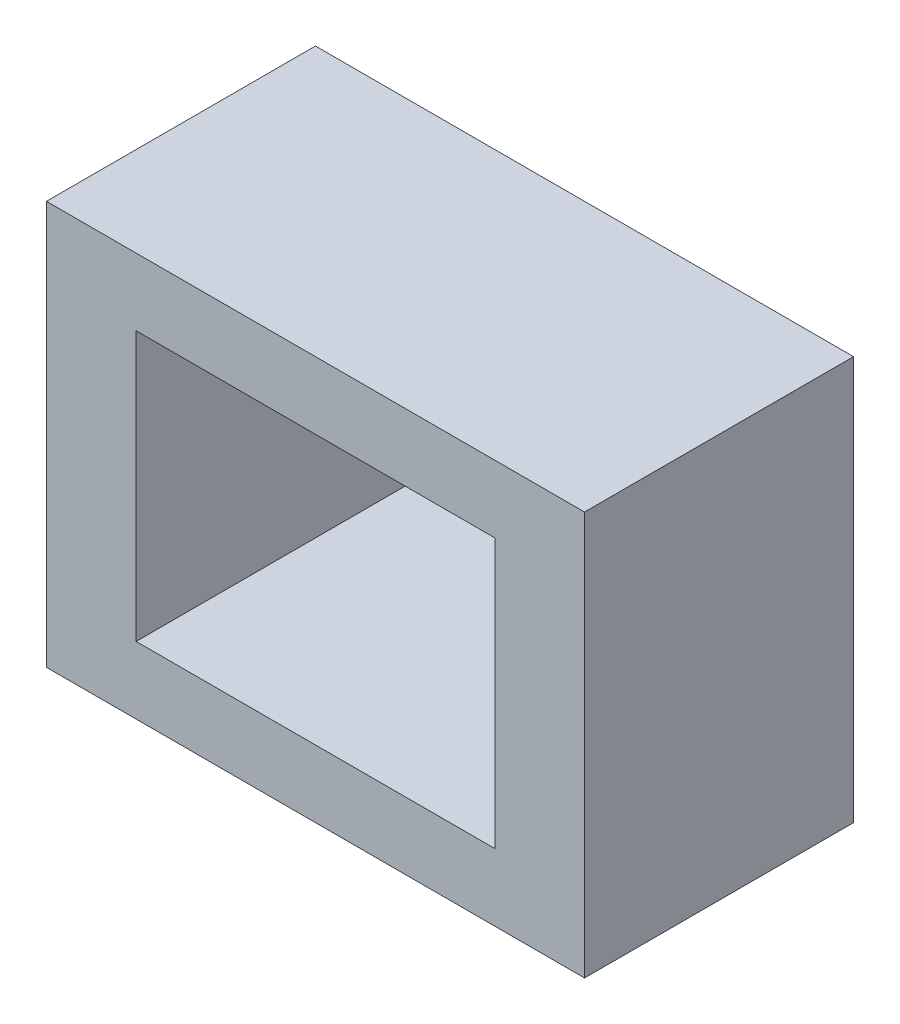
ISO-10303-21;
HEADER;
FILE_DESCRIPTION(('STEP AP214'),'2;1');
FILE_NAME('part.step','',(''),(''),'','','');
FILE_SCHEMA(('AUTOMOTIVE_DESIGN { 1 0 10303 214 1 1 1 1 }'));
ENDSEC;
DATA;
#1=APPLICATION_CONTEXT('core data for automotive mechanical design processes');
#2=APPLICATION_PROTOCOL_DEFINITION('international standard','automotive_design',2000,#1);
#3=PRODUCT_CONTEXT('',#1,'mechanical');
#4=PRODUCT('Part','Part','',(#3));
#5=PRODUCT_RELATED_PRODUCT_CATEGORY('part','',(#4));
#6=PRODUCT_DEFINITION_FORMATION('','',#4);
#7=PRODUCT_DEFINITION_CONTEXT('part definition',#1,'design');
#8=PRODUCT_DEFINITION('design','',#6,#7);
#9=PRODUCT_DEFINITION_SHAPE('','',#8);
#10=(LENGTH_UNIT() NAMED_UNIT(*) SI_UNIT(.MILLI.,.METRE.));
#11=(NAMED_UNIT(*) PLANE_ANGLE_UNIT() SI_UNIT($,.RADIAN.));
#12=(NAMED_UNIT(*) SI_UNIT($,.STERADIAN.) SOLID_ANGLE_UNIT());
#13=UNCERTAINTY_MEASURE_WITH_UNIT(LENGTH_MEASURE(1.E-05),#10,'distance_accuracy_value','');
#14=(GEOMETRIC_REPRESENTATION_CONTEXT(3) GLOBAL_UNCERTAINTY_ASSIGNED_CONTEXT((#13)) GLOBAL_UNIT_ASSIGNED_CONTEXT((#10,
#11,#12)) REPRESENTATION_CONTEXT('',''));
#15=CARTESIAN_POINT('',(0.,0.,0.));
#16=DIRECTION('',(0.,0.,1.));
#17=DIRECTION('',(1.,0.,0.));
#18=AXIS2_PLACEMENT_3D('',#15,#16,#17);
#19=CARTESIAN_POINT('',(0.,0.,150.));
#20=DIRECTION('',(0.,0.,1.));
#21=DIRECTION('',(1.,0.,0.));
#22=AXIS2_PLACEMENT_3D('',#19,#20,#21);
#23=PLANE('',#22);
#24=DIRECTION('',(0.,1.,0.));
#25=VECTOR('',#24,1.);
#26=CARTESIAN_POINT('',(300.,225.,150.));
#27=LINE('',#26,#25);
#28=CARTESIAN_POINT('',(300.,-225.,150.));
#29=VERTEX_POINT('',#28);
#30=CARTESIAN_POINT('',(300.,225.,150.));
#31=VERTEX_POINT('',#30);
#32=EDGE_CURVE('E134',#29,#31,#27,.T.);
#33=ORIENTED_EDGE('',*,*,#32,.T.);
#34=DIRECTION('',(-1.,0.,0.));
#35=VECTOR('',#34,1.);
#36=CARTESIAN_POINT('',(-300.,225.,150.));
#37=LINE('',#36,#35);
#38=CARTESIAN_POINT('',(-300.,225.,150.));
#39=VERTEX_POINT('',#38);
#40=EDGE_CURVE('E137',#31,#39,#37,.T.);
#41=ORIENTED_EDGE('',*,*,#40,.T.);
#42=DIRECTION('',(0.,-1.,0.));
#43=VECTOR('',#42,1.);
#44=CARTESIAN_POINT('',(-300.,225.,150.));
#45=LINE('',#44,#43);
#46=CARTESIAN_POINT('',(-300.,-225.,150.));
#47=VERTEX_POINT('',#46);
#48=EDGE_CURVE('E140',#39,#47,#45,.T.);
#49=ORIENTED_EDGE('',*,*,#48,.T.);
#50=DIRECTION('',(1.,0.,0.));
#51=VECTOR('',#50,1.);
#52=CARTESIAN_POINT('',(-300.,-225.,150.));
#53=LINE('',#52,#51);
#54=EDGE_CURVE('E142',#47,#29,#53,.T.);
#55=ORIENTED_EDGE('',*,*,#54,.T.);
#56=EDGE_LOOP('',(#33,#41,#49,#55));
#57=FACE_BOUND('',#56,.T.);
#58=DIRECTION('',(-1.,0.,0.));
#59=VECTOR('',#58,1.);
#60=CARTESIAN_POINT('',(-200.,150.,150.));
#61=LINE('',#60,#59);
#62=CARTESIAN_POINT('',(200.,150.,150.));
#63=VERTEX_POINT('',#62);
#64=CARTESIAN_POINT('',(-200.,150.,150.));
#65=VERTEX_POINT('',#64);
#66=EDGE_CURVE('E106',#63,#65,#61,.T.);
#67=ORIENTED_EDGE('',*,*,#66,.F.);
#68=DIRECTION('',(0.,1.,0.));
#69=VECTOR('',#68,1.);
#70=CARTESIAN_POINT('',(200.,-150.,150.));
#71=LINE('',#70,#69);
#72=CARTESIAN_POINT('',(200.,-150.,150.));
#73=VERTEX_POINT('',#72);
#74=EDGE_CURVE('E98',#73,#63,#71,.T.);
#75=ORIENTED_EDGE('',*,*,#74,.F.);
#76=DIRECTION('',(1.,0.,0.));
#77=VECTOR('',#76,1.);
#78=CARTESIAN_POINT('',(-200.,-150.,150.));
#79=LINE('',#78,#77);
#80=CARTESIAN_POINT('',(-200.,-150.,150.));
#81=VERTEX_POINT('',#80);
#82=EDGE_CURVE('E120',#81,#73,#79,.T.);
#83=ORIENTED_EDGE('',*,*,#82,.F.);
#84=DIRECTION('',(0.,-1.,0.));
#85=VECTOR('',#84,1.);
#86=CARTESIAN_POINT('',(-200.,-150.,150.));
#87=LINE('',#86,#85);
#88=EDGE_CURVE('E118',#65,#81,#87,.T.);
#89=ORIENTED_EDGE('',*,*,#88,.F.);
#90=EDGE_LOOP('',(#67,#75,#83,#89));
#91=FACE_BOUND('',#90,.T.);
#92=ADVANCED_FACE('F33',(#57,#91),#23,.T.);
#93=CARTESIAN_POINT('',(0.,0.,-150.));
#94=DIRECTION('',(0.,0.,1.));
#95=DIRECTION('',(1.,0.,0.));
#96=AXIS2_PLACEMENT_3D('',#93,#94,#95);
#97=PLANE('',#96);
#98=DIRECTION('',(0.,1.,0.));
#99=VECTOR('',#98,1.);
#100=CARTESIAN_POINT('',(300.,225.,-150.));
#101=LINE('',#100,#99);
#102=CARTESIAN_POINT('',(300.,-225.,-150.));
#103=VERTEX_POINT('',#102);
#104=CARTESIAN_POINT('',(300.,225.,-150.));
#105=VERTEX_POINT('',#104);
#106=EDGE_CURVE('E114',#103,#105,#101,.T.);
#107=ORIENTED_EDGE('',*,*,#106,.F.);
#108=DIRECTION('',(1.,0.,0.));
#109=VECTOR('',#108,1.);
#110=CARTESIAN_POINT('',(-300.,-225.,-150.));
#111=LINE('',#110,#109);
#112=CARTESIAN_POINT('',(-300.,-225.,-150.));
#113=VERTEX_POINT('',#112);
#114=EDGE_CURVE('E138',#113,#103,#111,.T.);
#115=ORIENTED_EDGE('',*,*,#114,.F.);
#116=DIRECTION('',(0.,-1.,0.));
#117=VECTOR('',#116,1.);
#118=CARTESIAN_POINT('',(-300.,225.,-150.));
#119=LINE('',#118,#117);
#120=CARTESIAN_POINT('',(-300.,225.,-150.));
#121=VERTEX_POINT('',#120);
#122=EDGE_CURVE('E149',#121,#113,#119,.T.);
#123=ORIENTED_EDGE('',*,*,#122,.F.);
#124=DIRECTION('',(-1.,0.,0.));
#125=VECTOR('',#124,1.);
#126=CARTESIAN_POINT('',(-300.,225.,-150.));
#127=LINE('',#126,#125);
#128=EDGE_CURVE('E147',#105,#121,#127,.T.);
#129=ORIENTED_EDGE('',*,*,#128,.F.);
#130=EDGE_LOOP('',(#107,#115,#123,#129));
#131=FACE_BOUND('',#130,.T.);
#132=DIRECTION('',(0.,1.,0.));
#133=VECTOR('',#132,1.);
#134=CARTESIAN_POINT('',(200.,-150.,-150.));
#135=LINE('',#134,#133);
#136=CARTESIAN_POINT('',(200.,-150.,-150.));
#137=VERTEX_POINT('',#136);
#138=CARTESIAN_POINT('',(200.,150.,-150.));
#139=VERTEX_POINT('',#138);
#140=EDGE_CURVE('E56',#137,#139,#135,.T.);
#141=ORIENTED_EDGE('',*,*,#140,.T.);
#142=DIRECTION('',(-1.,0.,0.));
#143=VECTOR('',#142,1.);
#144=CARTESIAN_POINT('',(-200.,150.,-150.));
#145=LINE('',#144,#143);
#146=CARTESIAN_POINT('',(-200.,150.,-150.));
#147=VERTEX_POINT('',#146);
#148=EDGE_CURVE('E113',#139,#147,#145,.T.);
#149=ORIENTED_EDGE('',*,*,#148,.T.);
#150=DIRECTION('',(0.,-1.,0.));
#151=VECTOR('',#150,1.);
#152=CARTESIAN_POINT('',(-200.,-150.,-150.));
#153=LINE('',#152,#151);
#154=CARTESIAN_POINT('',(-200.,-150.,-150.));
#155=VERTEX_POINT('',#154);
#156=EDGE_CURVE('E126',#147,#155,#153,.T.);
#157=ORIENTED_EDGE('',*,*,#156,.T.);
#158=DIRECTION('',(1.,0.,0.));
#159=VECTOR('',#158,1.);
#160=CARTESIAN_POINT('',(-200.,-150.,-150.));
#161=LINE('',#160,#159);
#162=EDGE_CURVE('E107',#155,#137,#161,.T.);
#163=ORIENTED_EDGE('',*,*,#162,.T.);
#164=EDGE_LOOP('',(#141,#149,#157,#163));
#165=FACE_BOUND('',#164,.T.);
#166=ADVANCED_FACE('F167',(#131,#165),#97,.F.);
#167=CARTESIAN_POINT('',(300.,225.,150.));
#168=DIRECTION('',(-1.,0.,0.));
#169=DIRECTION('',(0.,0.,1.));
#170=AXIS2_PLACEMENT_3D('',#167,#168,#169);
#171=PLANE('',#170);
#172=ORIENTED_EDGE('',*,*,#106,.T.);
#173=DIRECTION('',(0.,0.,-1.));
#174=VECTOR('',#173,1.);
#175=CARTESIAN_POINT('',(300.,225.,150.));
#176=LINE('',#175,#174);
#177=EDGE_CURVE('E11',#31,#105,#176,.T.);
#178=ORIENTED_EDGE('',*,*,#177,.F.);
#179=ORIENTED_EDGE('',*,*,#32,.F.);
#180=DIRECTION('',(0.,0.,-1.));
#181=VECTOR('',#180,1.);
#182=CARTESIAN_POINT('',(300.,-225.,150.));
#183=LINE('',#182,#181);
#184=EDGE_CURVE('E144',#29,#103,#183,.T.);
#185=ORIENTED_EDGE('',*,*,#184,.T.);
#186=EDGE_LOOP('',(#172,#178,#179,#185));
#187=FACE_BOUND('',#186,.T.);
#188=ADVANCED_FACE('F35',(#187),#171,.F.);
#189=CARTESIAN_POINT('',(-300.,225.,150.));
#190=DIRECTION('',(0.,-1.,0.));
#191=DIRECTION('',(0.,0.,-1.));
#192=AXIS2_PLACEMENT_3D('',#189,#190,#191);
#193=PLANE('',#192);
#194=ORIENTED_EDGE('',*,*,#128,.T.);
#195=DIRECTION('',(0.,0.,-1.));
#196=VECTOR('',#195,1.);
#197=CARTESIAN_POINT('',(-300.,225.,150.));
#198=LINE('',#197,#196);
#199=EDGE_CURVE('E41',#39,#121,#198,.T.);
#200=ORIENTED_EDGE('',*,*,#199,.F.);
#201=ORIENTED_EDGE('',*,*,#40,.F.);
#202=ORIENTED_EDGE('',*,*,#177,.T.);
#203=EDGE_LOOP('',(#194,#200,#201,#202));
#204=FACE_BOUND('',#203,.T.);
#205=ADVANCED_FACE('F177',(#204),#193,.F.);
#206=CARTESIAN_POINT('',(-300.,225.,150.));
#207=DIRECTION('',(1.,0.,0.));
#208=DIRECTION('',(0.,0.,-1.));
#209=AXIS2_PLACEMENT_3D('',#206,#207,#208);
#210=PLANE('',#209);
#211=ORIENTED_EDGE('',*,*,#122,.T.);
#212=DIRECTION('',(0.,0.,-1.));
#213=VECTOR('',#212,1.);
#214=CARTESIAN_POINT('',(-300.,-225.,150.));
#215=LINE('',#214,#213);
#216=EDGE_CURVE('E154',#47,#113,#215,.T.);
#217=ORIENTED_EDGE('',*,*,#216,.F.);
#218=ORIENTED_EDGE('',*,*,#48,.F.);
#219=ORIENTED_EDGE('',*,*,#199,.T.);
#220=EDGE_LOOP('',(#211,#217,#218,#219));
#221=FACE_BOUND('',#220,.T.);
#222=ADVANCED_FACE('F161',(#221),#210,.F.);
#223=CARTESIAN_POINT('',(-300.,-225.,150.));
#224=DIRECTION('',(0.,1.,0.));
#225=DIRECTION('',(0.,0.,1.));
#226=AXIS2_PLACEMENT_3D('',#223,#224,#225);
#227=PLANE('',#226);
#228=ORIENTED_EDGE('',*,*,#114,.T.);
#229=ORIENTED_EDGE('',*,*,#184,.F.);
#230=ORIENTED_EDGE('',*,*,#54,.F.);
#231=ORIENTED_EDGE('',*,*,#216,.T.);
#232=EDGE_LOOP('',(#228,#229,#230,#231));
#233=FACE_BOUND('',#232,.T.);
#234=ADVANCED_FACE('F171',(#233),#227,.F.);
#235=CARTESIAN_POINT('',(200.,-150.,150.));
#236=DIRECTION('',(-1.,0.,0.));
#237=DIRECTION('',(0.,0.,1.));
#238=AXIS2_PLACEMENT_3D('',#235,#236,#237);
#239=PLANE('',#238);
#240=ORIENTED_EDGE('',*,*,#140,.F.);
#241=DIRECTION('',(0.,0.,-1.));
#242=VECTOR('',#241,1.);
#243=CARTESIAN_POINT('',(200.,-150.,150.));
#244=LINE('',#243,#242);
#245=EDGE_CURVE('E102',#73,#137,#244,.T.);
#246=ORIENTED_EDGE('',*,*,#245,.F.);
#247=ORIENTED_EDGE('',*,*,#74,.T.);
#248=DIRECTION('',(0.,0.,-1.));
#249=VECTOR('',#248,1.);
#250=CARTESIAN_POINT('',(200.,150.,150.));
#251=LINE('',#250,#249);
#252=EDGE_CURVE('E101',#63,#139,#251,.T.);
#253=ORIENTED_EDGE('',*,*,#252,.T.);
#254=EDGE_LOOP('',(#240,#246,#247,#253));
#255=FACE_BOUND('',#254,.T.);
#256=ADVANCED_FACE('F100',(#255),#239,.T.);
#257=CARTESIAN_POINT('',(-200.,150.,150.));
#258=DIRECTION('',(0.,-1.,0.));
#259=DIRECTION('',(0.,0.,-1.));
#260=AXIS2_PLACEMENT_3D('',#257,#258,#259);
#261=PLANE('',#260);
#262=ORIENTED_EDGE('',*,*,#148,.F.);
#263=ORIENTED_EDGE('',*,*,#252,.F.);
#264=ORIENTED_EDGE('',*,*,#66,.T.);
#265=DIRECTION('',(0.,0.,-1.));
#266=VECTOR('',#265,1.);
#267=CARTESIAN_POINT('',(-200.,150.,150.));
#268=LINE('',#267,#266);
#269=EDGE_CURVE('E115',#65,#147,#268,.T.);
#270=ORIENTED_EDGE('',*,*,#269,.T.);
#271=EDGE_LOOP('',(#262,#263,#264,#270));
#272=FACE_BOUND('',#271,.T.);
#273=ADVANCED_FACE('F110',(#272),#261,.T.);
#274=CARTESIAN_POINT('',(-200.,-150.,150.));
#275=DIRECTION('',(1.,0.,0.));
#276=DIRECTION('',(0.,0.,-1.));
#277=AXIS2_PLACEMENT_3D('',#274,#275,#276);
#278=PLANE('',#277);
#279=ORIENTED_EDGE('',*,*,#156,.F.);
#280=ORIENTED_EDGE('',*,*,#269,.F.);
#281=ORIENTED_EDGE('',*,*,#88,.T.);
#282=DIRECTION('',(0.,0.,-1.));
#283=VECTOR('',#282,1.);
#284=CARTESIAN_POINT('',(-200.,-150.,150.));
#285=LINE('',#284,#283);
#286=EDGE_CURVE('E48',#81,#155,#285,.T.);
#287=ORIENTED_EDGE('',*,*,#286,.T.);
#288=EDGE_LOOP('',(#279,#280,#281,#287));
#289=FACE_BOUND('',#288,.T.);
#290=ADVANCED_FACE('F200',(#289),#278,.T.);
#291=CARTESIAN_POINT('',(-200.,-150.,150.));
#292=DIRECTION('',(0.,1.,0.));
#293=DIRECTION('',(0.,0.,1.));
#294=AXIS2_PLACEMENT_3D('',#291,#292,#293);
#295=PLANE('',#294);
#296=ORIENTED_EDGE('',*,*,#162,.F.);
#297=ORIENTED_EDGE('',*,*,#286,.F.);
#298=ORIENTED_EDGE('',*,*,#82,.T.);
#299=ORIENTED_EDGE('',*,*,#245,.T.);
#300=EDGE_LOOP('',(#296,#297,#298,#299));
#301=FACE_BOUND('',#300,.T.);
#302=ADVANCED_FACE('F204',(#301),#295,.T.);
#303=CLOSED_SHELL('',(#92,#166,#188,#205,#222,#234,#256,#273,#290,#302));
#304=MANIFOLD_SOLID_BREP('B2',#303);
#305=ADVANCED_BREP_SHAPE_REPRESENTATION('',(#18,#304),#14);
#306=SHAPE_DEFINITION_REPRESENTATION(#9,#305);
ENDSEC;
END-ISO-10303-21;
